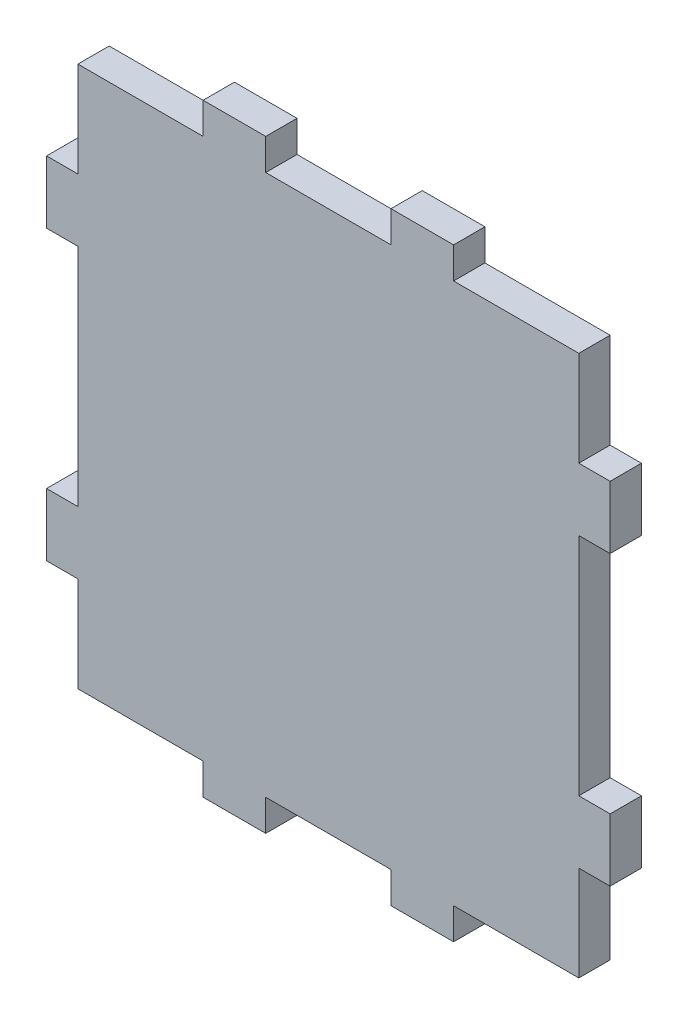
ISO-10303-21;
HEADER;
FILE_DESCRIPTION(('STEP AP214'),'2;1');
FILE_NAME('part.step','',(''),(''),'','','');
FILE_SCHEMA(('AUTOMOTIVE_DESIGN { 1 0 10303 214 1 1 1 1 }'));
ENDSEC;
DATA;
#1=APPLICATION_CONTEXT('core data for automotive mechanical design processes');
#2=APPLICATION_PROTOCOL_DEFINITION('international standard','automotive_design',2000,#1);
#3=PRODUCT_CONTEXT('',#1,'mechanical');
#4=PRODUCT('Part','Part','',(#3));
#5=PRODUCT_RELATED_PRODUCT_CATEGORY('part','',(#4));
#6=PRODUCT_DEFINITION_FORMATION('','',#4);
#7=PRODUCT_DEFINITION_CONTEXT('part definition',#1,'design');
#8=PRODUCT_DEFINITION('design','',#6,#7);
#9=PRODUCT_DEFINITION_SHAPE('','',#8);
#10=(LENGTH_UNIT() NAMED_UNIT(*) SI_UNIT(.MILLI.,.METRE.));
#11=(NAMED_UNIT(*) PLANE_ANGLE_UNIT() SI_UNIT($,.RADIAN.));
#12=(NAMED_UNIT(*) SI_UNIT($,.STERADIAN.) SOLID_ANGLE_UNIT());
#13=UNCERTAINTY_MEASURE_WITH_UNIT(LENGTH_MEASURE(1.E-05),#10,'distance_accuracy_value','');
#14=(GEOMETRIC_REPRESENTATION_CONTEXT(3) GLOBAL_UNCERTAINTY_ASSIGNED_CONTEXT((#13)) GLOBAL_UNIT_ASSIGNED_CONTEXT((#10,
#11,#12)) REPRESENTATION_CONTEXT('',''));
#15=CARTESIAN_POINT('',(0.,0.,0.));
#16=DIRECTION('',(0.,0.,1.));
#17=DIRECTION('',(1.,0.,0.));
#18=AXIS2_PLACEMENT_3D('',#15,#16,#17);
#19=CARTESIAN_POINT('',(-3.175,0.,3.175));
#20=DIRECTION('',(-1.,0.,0.));
#21=DIRECTION('',(0.,-1.,0.));
#22=AXIS2_PLACEMENT_3D('',#19,#20,#21);
#23=PLANE('',#22);
#24=DIRECTION('',(0.,1.,0.));
#25=VECTOR('',#24,1.);
#26=CARTESIAN_POINT('',(-3.175,0.,0.));
#27=LINE('',#26,#25);
#28=CARTESIAN_POINT('',(-3.175,-16.002,0.));
#29=VERTEX_POINT('',#28);
#30=CARTESIAN_POINT('',(-3.175,-9.652,0.));
#31=VERTEX_POINT('',#30);
#32=EDGE_CURVE('E297',#29,#31,#27,.T.);
#33=ORIENTED_EDGE('',*,*,#32,.F.);
#34=DIRECTION('',(0.,0.,-1.));
#35=VECTOR('',#34,1.);
#36=CARTESIAN_POINT('',(-3.175,-16.002,3.175));
#37=LINE('',#36,#35);
#38=CARTESIAN_POINT('',(-3.175,-16.002,3.175));
#39=VERTEX_POINT('',#38);
#40=EDGE_CURVE('E11',#39,#29,#37,.T.);
#41=ORIENTED_EDGE('',*,*,#40,.F.);
#42=DIRECTION('',(0.,1.,0.));
#43=VECTOR('',#42,1.);
#44=CARTESIAN_POINT('',(-3.175,0.,3.175));
#45=LINE('',#44,#43);
#46=CARTESIAN_POINT('',(-3.175,-9.652,3.175));
#47=VERTEX_POINT('',#46);
#48=EDGE_CURVE('E394',#39,#47,#45,.T.);
#49=ORIENTED_EDGE('',*,*,#48,.T.);
#50=DIRECTION('',(0.,0.,-1.));
#51=VECTOR('',#50,1.);
#52=CARTESIAN_POINT('',(-3.175,-9.652,3.175));
#53=LINE('',#52,#51);
#54=EDGE_CURVE('E169',#47,#31,#53,.T.);
#55=ORIENTED_EDGE('',*,*,#54,.T.);
#56=EDGE_LOOP('',(#33,#41,#49,#55));
#57=FACE_BOUND('',#56,.T.);
#58=ADVANCED_FACE('F35',(#57),#23,.T.);
#59=CARTESIAN_POINT('',(0.,-16.002,3.175));
#60=DIRECTION('',(0.,-1.,0.));
#61=DIRECTION('',(0.,0.,-1.));
#62=AXIS2_PLACEMENT_3D('',#59,#60,#61);
#63=PLANE('',#62);
#64=DIRECTION('',(-1.,0.,0.));
#65=VECTOR('',#64,1.);
#66=CARTESIAN_POINT('',(0.,-16.002,0.));
#67=LINE('',#66,#65);
#68=CARTESIAN_POINT('',(0.,-16.002,0.));
#69=VERTEX_POINT('',#68);
#70=EDGE_CURVE('E300',#69,#29,#67,.T.);
#71=ORIENTED_EDGE('',*,*,#70,.F.);
#72=DIRECTION('',(0.,0.,-1.));
#73=VECTOR('',#72,1.);
#74=CARTESIAN_POINT('',(0.,-16.002,3.175));
#75=LINE('',#74,#73);
#76=CARTESIAN_POINT('',(0.,-16.002,3.175));
#77=VERTEX_POINT('',#76);
#78=EDGE_CURVE('E43',#77,#69,#75,.T.);
#79=ORIENTED_EDGE('',*,*,#78,.F.);
#80=DIRECTION('',(-1.,0.,0.));
#81=VECTOR('',#80,1.);
#82=CARTESIAN_POINT('',(0.,-16.002,3.175));
#83=LINE('',#82,#81);
#84=EDGE_CURVE('E477',#77,#39,#83,.T.);
#85=ORIENTED_EDGE('',*,*,#84,.T.);
#86=ORIENTED_EDGE('',*,*,#40,.T.);
#87=EDGE_LOOP('',(#71,#79,#85,#86));
#88=FACE_BOUND('',#87,.T.);
#89=ADVANCED_FACE('F476',(#88),#63,.T.);
#90=CARTESIAN_POINT('',(0.,0.,3.175));
#91=DIRECTION('',(1.,0.,0.));
#92=DIRECTION('',(0.,1.,0.));
#93=AXIS2_PLACEMENT_3D('',#90,#91,#92);
#94=PLANE('',#93);
#95=DIRECTION('',(0.,-1.,0.));
#96=VECTOR('',#95,1.);
#97=CARTESIAN_POINT('',(0.,0.,0.));
#98=LINE('',#97,#96);
#99=CARTESIAN_POINT('',(0.,-38.862,0.));
#100=VERTEX_POINT('',#99);
#101=EDGE_CURVE('E303',#69,#100,#98,.T.);
#102=ORIENTED_EDGE('',*,*,#101,.T.);
#103=DIRECTION('',(0.,0.,-1.));
#104=VECTOR('',#103,1.);
#105=CARTESIAN_POINT('',(0.,-38.862,3.175));
#106=LINE('',#105,#104);
#107=CARTESIAN_POINT('',(0.,-38.862,3.175));
#108=VERTEX_POINT('',#107);
#109=EDGE_CURVE('E461',#108,#100,#106,.T.);
#110=ORIENTED_EDGE('',*,*,#109,.F.);
#111=DIRECTION('',(0.,-1.,0.));
#112=VECTOR('',#111,1.);
#113=CARTESIAN_POINT('',(0.,0.,3.175));
#114=LINE('',#113,#112);
#115=EDGE_CURVE('E468',#77,#108,#114,.T.);
#116=ORIENTED_EDGE('',*,*,#115,.F.);
#117=ORIENTED_EDGE('',*,*,#78,.T.);
#118=EDGE_LOOP('',(#102,#110,#116,#117));
#119=FACE_BOUND('',#118,.T.);
#120=ADVANCED_FACE('F466',(#119),#94,.F.);
#121=CARTESIAN_POINT('',(0.,-38.862,3.175));
#122=DIRECTION('',(0.,-1.,0.));
#123=DIRECTION('',(0.,0.,-1.));
#124=AXIS2_PLACEMENT_3D('',#121,#122,#123);
#125=PLANE('',#124);
#126=DIRECTION('',(-1.,0.,0.));
#127=VECTOR('',#126,1.);
#128=CARTESIAN_POINT('',(0.,-38.862,0.));
#129=LINE('',#128,#127);
#130=CARTESIAN_POINT('',(-3.17500000000001,-38.862,0.));
#131=VERTEX_POINT('',#130);
#132=EDGE_CURVE('E305',#100,#131,#129,.T.);
#133=ORIENTED_EDGE('',*,*,#132,.T.);
#134=DIRECTION('',(0.,0.,-1.));
#135=VECTOR('',#134,1.);
#136=CARTESIAN_POINT('',(-3.17500000000001,-38.862,3.175));
#137=LINE('',#136,#135);
#138=CARTESIAN_POINT('',(-3.17500000000001,-38.862,3.175));
#139=VERTEX_POINT('',#138);
#140=EDGE_CURVE('E459',#139,#131,#137,.T.);
#141=ORIENTED_EDGE('',*,*,#140,.F.);
#142=DIRECTION('',(-1.,0.,0.));
#143=VECTOR('',#142,1.);
#144=CARTESIAN_POINT('',(0.,-38.862,3.175));
#145=LINE('',#144,#143);
#146=EDGE_CURVE('E485',#108,#139,#145,.T.);
#147=ORIENTED_EDGE('',*,*,#146,.F.);
#148=ORIENTED_EDGE('',*,*,#109,.T.);
#149=EDGE_LOOP('',(#133,#141,#147,#148));
#150=FACE_BOUND('',#149,.T.);
#151=ADVANCED_FACE('F681',(#150),#125,.F.);
#152=CARTESIAN_POINT('',(-3.17500000000001,0.,3.175));
#153=DIRECTION('',(-1.,0.,0.));
#154=DIRECTION('',(0.,0.,1.));
#155=AXIS2_PLACEMENT_3D('',#152,#153,#154);
#156=PLANE('',#155);
#157=DIRECTION('',(0.,1.,0.));
#158=VECTOR('',#157,1.);
#159=CARTESIAN_POINT('',(-3.17500000000001,0.,0.));
#160=LINE('',#159,#158);
#161=CARTESIAN_POINT('',(-3.17500000000001,-45.212,0.));
#162=VERTEX_POINT('',#161);
#163=EDGE_CURVE('E308',#162,#131,#160,.T.);
#164=ORIENTED_EDGE('',*,*,#163,.F.);
#165=DIRECTION('',(0.,0.,-1.));
#166=VECTOR('',#165,1.);
#167=CARTESIAN_POINT('',(-3.17500000000001,-45.212,3.175));
#168=LINE('',#167,#166);
#169=CARTESIAN_POINT('',(-3.17500000000001,-45.212,3.175));
#170=VERTEX_POINT('',#169);
#171=EDGE_CURVE('E457',#170,#162,#168,.T.);
#172=ORIENTED_EDGE('',*,*,#171,.F.);
#173=DIRECTION('',(0.,1.,0.));
#174=VECTOR('',#173,1.);
#175=CARTESIAN_POINT('',(-3.17500000000001,0.,3.175));
#176=LINE('',#175,#174);
#177=EDGE_CURVE('E487',#170,#139,#176,.T.);
#178=ORIENTED_EDGE('',*,*,#177,.T.);
#179=ORIENTED_EDGE('',*,*,#140,.T.);
#180=EDGE_LOOP('',(#164,#172,#178,#179));
#181=FACE_BOUND('',#180,.T.);
#182=ADVANCED_FACE('F677',(#181),#156,.T.);
#183=CARTESIAN_POINT('',(0.,-45.212,3.175));
#184=DIRECTION('',(0.,-1.,0.));
#185=DIRECTION('',(0.,0.,-1.));
#186=AXIS2_PLACEMENT_3D('',#183,#184,#185);
#187=PLANE('',#186);
#188=DIRECTION('',(-1.,0.,0.));
#189=VECTOR('',#188,1.);
#190=CARTESIAN_POINT('',(0.,-45.212,0.));
#191=LINE('',#190,#189);
#192=CARTESIAN_POINT('',(0.,-45.212,0.));
#193=VERTEX_POINT('',#192);
#194=EDGE_CURVE('E311',#193,#162,#191,.T.);
#195=ORIENTED_EDGE('',*,*,#194,.F.);
#196=DIRECTION('',(0.,0.,-1.));
#197=VECTOR('',#196,1.);
#198=CARTESIAN_POINT('',(0.,-45.212,3.175));
#199=LINE('',#198,#197);
#200=CARTESIAN_POINT('',(0.,-45.212,3.175));
#201=VERTEX_POINT('',#200);
#202=EDGE_CURVE('E455',#201,#193,#199,.T.);
#203=ORIENTED_EDGE('',*,*,#202,.F.);
#204=DIRECTION('',(-1.,0.,0.));
#205=VECTOR('',#204,1.);
#206=CARTESIAN_POINT('',(0.,-45.212,3.175));
#207=LINE('',#206,#205);
#208=EDGE_CURVE('E490',#201,#170,#207,.T.);
#209=ORIENTED_EDGE('',*,*,#208,.T.);
#210=ORIENTED_EDGE('',*,*,#171,.T.);
#211=EDGE_LOOP('',(#195,#203,#209,#210));
#212=FACE_BOUND('',#211,.T.);
#213=ADVANCED_FACE('F671',(#212),#187,.T.);
#214=CARTESIAN_POINT('',(0.,0.,3.175));
#215=DIRECTION('',(1.,0.,0.));
#216=DIRECTION('',(0.,1.,0.));
#217=AXIS2_PLACEMENT_3D('',#214,#215,#216);
#218=PLANE('',#217);
#219=DIRECTION('',(0.,-1.,0.));
#220=VECTOR('',#219,1.);
#221=CARTESIAN_POINT('',(0.,0.,0.));
#222=LINE('',#221,#220);
#223=CARTESIAN_POINT('',(0.,-54.864,0.));
#224=VERTEX_POINT('',#223);
#225=EDGE_CURVE('E314',#193,#224,#222,.T.);
#226=ORIENTED_EDGE('',*,*,#225,.T.);
#227=DIRECTION('',(0.,0.,-1.));
#228=VECTOR('',#227,1.);
#229=CARTESIAN_POINT('',(0.,-54.864,3.175));
#230=LINE('',#229,#228);
#231=CARTESIAN_POINT('',(0.,-54.864,3.175));
#232=VERTEX_POINT('',#231);
#233=EDGE_CURVE('E452',#232,#224,#230,.T.);
#234=ORIENTED_EDGE('',*,*,#233,.F.);
#235=DIRECTION('',(0.,-1.,0.));
#236=VECTOR('',#235,1.);
#237=CARTESIAN_POINT('',(0.,0.,3.175));
#238=LINE('',#237,#236);
#239=EDGE_CURVE('E493',#201,#232,#238,.T.);
#240=ORIENTED_EDGE('',*,*,#239,.F.);
#241=ORIENTED_EDGE('',*,*,#202,.T.);
#242=EDGE_LOOP('',(#226,#234,#240,#241));
#243=FACE_BOUND('',#242,.T.);
#244=ADVANCED_FACE('F682',(#243),#218,.F.);
#245=CARTESIAN_POINT('',(0.,-54.864,3.175));
#246=DIRECTION('',(0.,1.,0.));
#247=DIRECTION('',(0.,0.,1.));
#248=AXIS2_PLACEMENT_3D('',#245,#246,#247);
#249=PLANE('',#248);
#250=DIRECTION('',(1.,0.,0.));
#251=VECTOR('',#250,1.);
#252=CARTESIAN_POINT('',(0.,-54.864,0.));
#253=LINE('',#252,#251);
#254=CARTESIAN_POINT('',(12.7,-54.864,0.));
#255=VERTEX_POINT('',#254);
#256=EDGE_CURVE('E316',#224,#255,#253,.T.);
#257=ORIENTED_EDGE('',*,*,#256,.T.);
#258=DIRECTION('',(0.,0.,-1.));
#259=VECTOR('',#258,1.);
#260=CARTESIAN_POINT('',(12.7,-54.864,3.175));
#261=LINE('',#260,#259);
#262=CARTESIAN_POINT('',(12.7,-54.864,3.175));
#263=VERTEX_POINT('',#262);
#264=EDGE_CURVE('E449',#263,#255,#261,.T.);
#265=ORIENTED_EDGE('',*,*,#264,.F.);
#266=DIRECTION('',(1.,0.,0.));
#267=VECTOR('',#266,1.);
#268=CARTESIAN_POINT('',(0.,-54.864,3.175));
#269=LINE('',#268,#267);
#270=EDGE_CURVE('E495',#232,#263,#269,.T.);
#271=ORIENTED_EDGE('',*,*,#270,.F.);
#272=ORIENTED_EDGE('',*,*,#233,.T.);
#273=EDGE_LOOP('',(#257,#265,#271,#272));
#274=FACE_BOUND('',#273,.T.);
#275=ADVANCED_FACE('F665',(#274),#249,.F.);
#276=CARTESIAN_POINT('',(12.7,0.,3.175));
#277=DIRECTION('',(1.,0.,0.));
#278=DIRECTION('',(0.,0.,-1.));
#279=AXIS2_PLACEMENT_3D('',#276,#277,#278);
#280=PLANE('',#279);
#281=DIRECTION('',(0.,-1.,0.));
#282=VECTOR('',#281,1.);
#283=CARTESIAN_POINT('',(12.7,0.,0.));
#284=LINE('',#283,#282);
#285=CARTESIAN_POINT('',(12.7,-58.039,0.));
#286=VERTEX_POINT('',#285);
#287=EDGE_CURVE('E318',#255,#286,#284,.T.);
#288=ORIENTED_EDGE('',*,*,#287,.T.);
#289=DIRECTION('',(0.,0.,-1.));
#290=VECTOR('',#289,1.);
#291=CARTESIAN_POINT('',(12.7,-58.039,3.175));
#292=LINE('',#291,#290);
#293=CARTESIAN_POINT('',(12.7,-58.039,3.175));
#294=VERTEX_POINT('',#293);
#295=EDGE_CURVE('E446',#294,#286,#292,.T.);
#296=ORIENTED_EDGE('',*,*,#295,.F.);
#297=DIRECTION('',(0.,-1.,0.));
#298=VECTOR('',#297,1.);
#299=CARTESIAN_POINT('',(12.7,0.,3.175));
#300=LINE('',#299,#298);
#301=EDGE_CURVE('E497',#263,#294,#300,.T.);
#302=ORIENTED_EDGE('',*,*,#301,.F.);
#303=ORIENTED_EDGE('',*,*,#264,.T.);
#304=EDGE_LOOP('',(#288,#296,#302,#303));
#305=FACE_BOUND('',#304,.T.);
#306=ADVANCED_FACE('F661',(#305),#280,.F.);
#307=CARTESIAN_POINT('',(0.,-58.039,3.175));
#308=DIRECTION('',(0.,1.,0.));
#309=DIRECTION('',(0.,0.,1.));
#310=AXIS2_PLACEMENT_3D('',#307,#308,#309);
#311=PLANE('',#310);
#312=DIRECTION('',(1.,0.,0.));
#313=VECTOR('',#312,1.);
#314=CARTESIAN_POINT('',(0.,-58.039,0.));
#315=LINE('',#314,#313);
#316=CARTESIAN_POINT('',(19.05,-58.039,0.));
#317=VERTEX_POINT('',#316);
#318=EDGE_CURVE('E320',#286,#317,#315,.T.);
#319=ORIENTED_EDGE('',*,*,#318,.T.);
#320=DIRECTION('',(0.,0.,-1.));
#321=VECTOR('',#320,1.);
#322=CARTESIAN_POINT('',(19.05,-58.039,3.175));
#323=LINE('',#322,#321);
#324=CARTESIAN_POINT('',(19.05,-58.039,3.175));
#325=VERTEX_POINT('',#324);
#326=EDGE_CURVE('E444',#325,#317,#323,.T.);
#327=ORIENTED_EDGE('',*,*,#326,.F.);
#328=DIRECTION('',(1.,0.,0.));
#329=VECTOR('',#328,1.);
#330=CARTESIAN_POINT('',(0.,-58.039,3.175));
#331=LINE('',#330,#329);
#332=EDGE_CURVE('E499',#294,#325,#331,.T.);
#333=ORIENTED_EDGE('',*,*,#332,.F.);
#334=ORIENTED_EDGE('',*,*,#295,.T.);
#335=EDGE_LOOP('',(#319,#327,#333,#334));
#336=FACE_BOUND('',#335,.T.);
#337=ADVANCED_FACE('F656',(#336),#311,.F.);
#338=CARTESIAN_POINT('',(19.0500000000001,0.,3.175));
#339=DIRECTION('',(1.,0.,0.));
#340=DIRECTION('',(0.,1.,0.));
#341=AXIS2_PLACEMENT_3D('',#338,#339,#340);
#342=PLANE('',#341);
#343=DIRECTION('',(0.,-1.,0.));
#344=VECTOR('',#343,1.);
#345=CARTESIAN_POINT('',(19.0500000000001,0.,0.));
#346=LINE('',#345,#344);
#347=CARTESIAN_POINT('',(19.05,-54.864,0.));
#348=VERTEX_POINT('',#347);
#349=EDGE_CURVE('E323',#348,#317,#346,.T.);
#350=ORIENTED_EDGE('',*,*,#349,.F.);
#351=DIRECTION('',(0.,0.,-1.));
#352=VECTOR('',#351,1.);
#353=CARTESIAN_POINT('',(19.05,-54.864,3.175));
#354=LINE('',#353,#352);
#355=CARTESIAN_POINT('',(19.05,-54.864,3.175));
#356=VERTEX_POINT('',#355);
#357=EDGE_CURVE('E442',#356,#348,#354,.T.);
#358=ORIENTED_EDGE('',*,*,#357,.F.);
#359=DIRECTION('',(0.,-1.,0.));
#360=VECTOR('',#359,1.);
#361=CARTESIAN_POINT('',(19.0500000000001,0.,3.175));
#362=LINE('',#361,#360);
#363=EDGE_CURVE('E501',#356,#325,#362,.T.);
#364=ORIENTED_EDGE('',*,*,#363,.T.);
#365=ORIENTED_EDGE('',*,*,#326,.T.);
#366=EDGE_LOOP('',(#350,#358,#364,#365));
#367=FACE_BOUND('',#366,.T.);
#368=ADVANCED_FACE('F650',(#367),#342,.T.);
#369=CARTESIAN_POINT('',(0.,-54.864,3.175));
#370=DIRECTION('',(0.,1.,0.));
#371=DIRECTION('',(-1.,0.,0.));
#372=AXIS2_PLACEMENT_3D('',#369,#370,#371);
#373=PLANE('',#372);
#374=DIRECTION('',(1.,0.,0.));
#375=VECTOR('',#374,1.);
#376=CARTESIAN_POINT('',(0.,-54.864,0.));
#377=LINE('',#376,#375);
#378=CARTESIAN_POINT('',(31.75,-54.864,0.));
#379=VERTEX_POINT('',#378);
#380=EDGE_CURVE('E326',#348,#379,#377,.T.);
#381=ORIENTED_EDGE('',*,*,#380,.T.);
#382=DIRECTION('',(0.,0.,-1.));
#383=VECTOR('',#382,1.);
#384=CARTESIAN_POINT('',(31.75,-54.864,3.175));
#385=LINE('',#384,#383);
#386=CARTESIAN_POINT('',(31.75,-54.864,3.175));
#387=VERTEX_POINT('',#386);
#388=EDGE_CURVE('E439',#387,#379,#385,.T.);
#389=ORIENTED_EDGE('',*,*,#388,.F.);
#390=DIRECTION('',(1.,0.,0.));
#391=VECTOR('',#390,1.);
#392=CARTESIAN_POINT('',(0.,-54.864,3.175));
#393=LINE('',#392,#391);
#394=EDGE_CURVE('E504',#356,#387,#393,.T.);
#395=ORIENTED_EDGE('',*,*,#394,.F.);
#396=ORIENTED_EDGE('',*,*,#357,.T.);
#397=EDGE_LOOP('',(#381,#389,#395,#396));
#398=FACE_BOUND('',#397,.T.);
#399=ADVANCED_FACE('F647',(#398),#373,.F.);
#400=CARTESIAN_POINT('',(31.75,0.,3.175));
#401=DIRECTION('',(1.,0.,0.));
#402=DIRECTION('',(0.,0.,-1.));
#403=AXIS2_PLACEMENT_3D('',#400,#401,#402);
#404=PLANE('',#403);
#405=DIRECTION('',(0.,-1.,0.));
#406=VECTOR('',#405,1.);
#407=CARTESIAN_POINT('',(31.75,0.,0.));
#408=LINE('',#407,#406);
#409=CARTESIAN_POINT('',(31.75,-58.039,0.));
#410=VERTEX_POINT('',#409);
#411=EDGE_CURVE('E328',#379,#410,#408,.T.);
#412=ORIENTED_EDGE('',*,*,#411,.T.);
#413=DIRECTION('',(0.,0.,-1.));
#414=VECTOR('',#413,1.);
#415=CARTESIAN_POINT('',(31.75,-58.039,3.175));
#416=LINE('',#415,#414);
#417=CARTESIAN_POINT('',(31.75,-58.039,3.175));
#418=VERTEX_POINT('',#417);
#419=EDGE_CURVE('E436',#418,#410,#416,.T.);
#420=ORIENTED_EDGE('',*,*,#419,.F.);
#421=DIRECTION('',(0.,-1.,0.));
#422=VECTOR('',#421,1.);
#423=CARTESIAN_POINT('',(31.75,0.,3.175));
#424=LINE('',#423,#422);
#425=EDGE_CURVE('E506',#387,#418,#424,.T.);
#426=ORIENTED_EDGE('',*,*,#425,.F.);
#427=ORIENTED_EDGE('',*,*,#388,.T.);
#428=EDGE_LOOP('',(#412,#420,#426,#427));
#429=FACE_BOUND('',#428,.T.);
#430=ADVANCED_FACE('F642',(#429),#404,.F.);
#431=CARTESIAN_POINT('',(0.,-58.039,3.175));
#432=DIRECTION('',(0.,1.,0.));
#433=DIRECTION('',(0.,0.,1.));
#434=AXIS2_PLACEMENT_3D('',#431,#432,#433);
#435=PLANE('',#434);
#436=DIRECTION('',(1.,0.,0.));
#437=VECTOR('',#436,1.);
#438=CARTESIAN_POINT('',(0.,-58.039,0.));
#439=LINE('',#438,#437);
#440=CARTESIAN_POINT('',(38.1,-58.039,0.));
#441=VERTEX_POINT('',#440);
#442=EDGE_CURVE('E330',#410,#441,#439,.T.);
#443=ORIENTED_EDGE('',*,*,#442,.T.);
#444=DIRECTION('',(0.,0.,-1.));
#445=VECTOR('',#444,1.);
#446=CARTESIAN_POINT('',(38.1,-58.039,3.175));
#447=LINE('',#446,#445);
#448=CARTESIAN_POINT('',(38.1,-58.039,3.175));
#449=VERTEX_POINT('',#448);
#450=EDGE_CURVE('E434',#449,#441,#447,.T.);
#451=ORIENTED_EDGE('',*,*,#450,.F.);
#452=DIRECTION('',(1.,0.,0.));
#453=VECTOR('',#452,1.);
#454=CARTESIAN_POINT('',(0.,-58.039,3.175));
#455=LINE('',#454,#453);
#456=EDGE_CURVE('E508',#418,#449,#455,.T.);
#457=ORIENTED_EDGE('',*,*,#456,.F.);
#458=ORIENTED_EDGE('',*,*,#419,.T.);
#459=EDGE_LOOP('',(#443,#451,#457,#458));
#460=FACE_BOUND('',#459,.T.);
#461=ADVANCED_FACE('F636',(#460),#435,.F.);
#462=CARTESIAN_POINT('',(38.1,0.,3.175));
#463=DIRECTION('',(1.,0.,0.));
#464=DIRECTION('',(0.,0.,-1.));
#465=AXIS2_PLACEMENT_3D('',#462,#463,#464);
#466=PLANE('',#465);
#467=DIRECTION('',(0.,-1.,0.));
#468=VECTOR('',#467,1.);
#469=CARTESIAN_POINT('',(38.1,0.,0.));
#470=LINE('',#469,#468);
#471=CARTESIAN_POINT('',(38.1,-54.864,0.));
#472=VERTEX_POINT('',#471);
#473=EDGE_CURVE('E333',#472,#441,#470,.T.);
#474=ORIENTED_EDGE('',*,*,#473,.F.);
#475=DIRECTION('',(0.,0.,-1.));
#476=VECTOR('',#475,1.);
#477=CARTESIAN_POINT('',(38.1,-54.864,3.175));
#478=LINE('',#477,#476);
#479=CARTESIAN_POINT('',(38.1,-54.864,3.175));
#480=VERTEX_POINT('',#479);
#481=EDGE_CURVE('E432',#480,#472,#478,.T.);
#482=ORIENTED_EDGE('',*,*,#481,.F.);
#483=DIRECTION('',(0.,-1.,0.));
#484=VECTOR('',#483,1.);
#485=CARTESIAN_POINT('',(38.1,0.,3.175));
#486=LINE('',#485,#484);
#487=EDGE_CURVE('E510',#480,#449,#486,.T.);
#488=ORIENTED_EDGE('',*,*,#487,.T.);
#489=ORIENTED_EDGE('',*,*,#450,.T.);
#490=EDGE_LOOP('',(#474,#482,#488,#489));
#491=FACE_BOUND('',#490,.T.);
#492=ADVANCED_FACE('F630',(#491),#466,.T.);
#493=CARTESIAN_POINT('',(0.,-54.864,3.175));
#494=DIRECTION('',(0.,1.,0.));
#495=DIRECTION('',(0.,0.,1.));
#496=AXIS2_PLACEMENT_3D('',#493,#494,#495);
#497=PLANE('',#496);
#498=DIRECTION('',(1.,0.,0.));
#499=VECTOR('',#498,1.);
#500=CARTESIAN_POINT('',(0.,-54.864,0.));
#501=LINE('',#500,#499);
#502=CARTESIAN_POINT('',(50.8,-54.864,0.));
#503=VERTEX_POINT('',#502);
#504=EDGE_CURVE('E336',#472,#503,#501,.T.);
#505=ORIENTED_EDGE('',*,*,#504,.T.);
#506=DIRECTION('',(0.,0.,-1.));
#507=VECTOR('',#506,1.);
#508=CARTESIAN_POINT('',(50.8,-54.864,3.175));
#509=LINE('',#508,#507);
#510=CARTESIAN_POINT('',(50.8,-54.864,3.175));
#511=VERTEX_POINT('',#510);
#512=EDGE_CURVE('E430',#511,#503,#509,.T.);
#513=ORIENTED_EDGE('',*,*,#512,.F.);
#514=DIRECTION('',(1.,0.,0.));
#515=VECTOR('',#514,1.);
#516=CARTESIAN_POINT('',(0.,-54.864,3.175));
#517=LINE('',#516,#515);
#518=EDGE_CURVE('E513',#480,#511,#517,.T.);
#519=ORIENTED_EDGE('',*,*,#518,.F.);
#520=ORIENTED_EDGE('',*,*,#481,.T.);
#521=EDGE_LOOP('',(#505,#513,#519,#520));
#522=FACE_BOUND('',#521,.T.);
#523=ADVANCED_FACE('F778',(#522),#497,.F.);
#524=CARTESIAN_POINT('',(50.8,0.,3.175));
#525=DIRECTION('',(1.,0.,0.));
#526=DIRECTION('',(0.,0.,-1.));
#527=AXIS2_PLACEMENT_3D('',#524,#525,#526);
#528=PLANE('',#527);
#529=DIRECTION('',(0.,-1.,0.));
#530=VECTOR('',#529,1.);
#531=CARTESIAN_POINT('',(50.8,0.,0.));
#532=LINE('',#531,#530);
#533=CARTESIAN_POINT('',(50.8,-45.212,0.));
#534=VERTEX_POINT('',#533);
#535=EDGE_CURVE('E339',#534,#503,#532,.T.);
#536=ORIENTED_EDGE('',*,*,#535,.F.);
#537=DIRECTION('',(0.,0.,-1.));
#538=VECTOR('',#537,1.);
#539=CARTESIAN_POINT('',(50.8,-45.212,3.175));
#540=LINE('',#539,#538);
#541=CARTESIAN_POINT('',(50.8,-45.212,3.175));
#542=VERTEX_POINT('',#541);
#543=EDGE_CURVE('E428',#542,#534,#540,.T.);
#544=ORIENTED_EDGE('',*,*,#543,.F.);
#545=DIRECTION('',(0.,-1.,0.));
#546=VECTOR('',#545,1.);
#547=CARTESIAN_POINT('',(50.8,0.,3.175));
#548=LINE('',#547,#546);
#549=EDGE_CURVE('E515',#542,#511,#548,.T.);
#550=ORIENTED_EDGE('',*,*,#549,.T.);
#551=ORIENTED_EDGE('',*,*,#512,.T.);
#552=EDGE_LOOP('',(#536,#544,#550,#551));
#553=FACE_BOUND('',#552,.T.);
#554=ADVANCED_FACE('F623',(#553),#528,.T.);
#555=CARTESIAN_POINT('',(0.,-45.212,3.175));
#556=DIRECTION('',(0.,1.,0.));
#557=DIRECTION('',(0.,0.,1.));
#558=AXIS2_PLACEMENT_3D('',#555,#556,#557);
#559=PLANE('',#558);
#560=DIRECTION('',(1.,0.,0.));
#561=VECTOR('',#560,1.);
#562=CARTESIAN_POINT('',(0.,-45.212,0.));
#563=LINE('',#562,#561);
#564=CARTESIAN_POINT('',(53.975,-45.212,0.));
#565=VERTEX_POINT('',#564);
#566=EDGE_CURVE('E342',#534,#565,#563,.T.);
#567=ORIENTED_EDGE('',*,*,#566,.T.);
#568=DIRECTION('',(0.,0.,-1.));
#569=VECTOR('',#568,1.);
#570=CARTESIAN_POINT('',(53.975,-45.212,3.175));
#571=LINE('',#570,#569);
#572=CARTESIAN_POINT('',(53.975,-45.212,3.175));
#573=VERTEX_POINT('',#572);
#574=EDGE_CURVE('E426',#573,#565,#571,.T.);
#575=ORIENTED_EDGE('',*,*,#574,.F.);
#576=DIRECTION('',(1.,0.,0.));
#577=VECTOR('',#576,1.);
#578=CARTESIAN_POINT('',(0.,-45.212,3.175));
#579=LINE('',#578,#577);
#580=EDGE_CURVE('E518',#542,#573,#579,.T.);
#581=ORIENTED_EDGE('',*,*,#580,.F.);
#582=ORIENTED_EDGE('',*,*,#543,.T.);
#583=EDGE_LOOP('',(#567,#575,#581,#582));
#584=FACE_BOUND('',#583,.T.);
#585=ADVANCED_FACE('F620',(#584),#559,.F.);
#586=CARTESIAN_POINT('',(53.975,0.,3.175));
#587=DIRECTION('',(1.,0.,0.));
#588=DIRECTION('',(0.,0.,-1.));
#589=AXIS2_PLACEMENT_3D('',#586,#587,#588);
#590=PLANE('',#589);
#591=DIRECTION('',(0.,-1.,0.));
#592=VECTOR('',#591,1.);
#593=CARTESIAN_POINT('',(53.975,0.,0.));
#594=LINE('',#593,#592);
#595=CARTESIAN_POINT('',(53.975,-38.862,0.));
#596=VERTEX_POINT('',#595);
#597=EDGE_CURVE('E345',#596,#565,#594,.T.);
#598=ORIENTED_EDGE('',*,*,#597,.F.);
#599=DIRECTION('',(0.,0.,-1.));
#600=VECTOR('',#599,1.);
#601=CARTESIAN_POINT('',(53.975,-38.862,3.175));
#602=LINE('',#601,#600);
#603=CARTESIAN_POINT('',(53.975,-38.862,3.175));
#604=VERTEX_POINT('',#603);
#605=EDGE_CURVE('E424',#604,#596,#602,.T.);
#606=ORIENTED_EDGE('',*,*,#605,.F.);
#607=DIRECTION('',(0.,-1.,0.));
#608=VECTOR('',#607,1.);
#609=CARTESIAN_POINT('',(53.975,0.,3.175));
#610=LINE('',#609,#608);
#611=EDGE_CURVE('E520',#604,#573,#610,.T.);
#612=ORIENTED_EDGE('',*,*,#611,.T.);
#613=ORIENTED_EDGE('',*,*,#574,.T.);
#614=EDGE_LOOP('',(#598,#606,#612,#613));
#615=FACE_BOUND('',#614,.T.);
#616=ADVANCED_FACE('F615',(#615),#590,.T.);
#617=CARTESIAN_POINT('',(1.6986412276765E-13,-38.8620000000002,3.175));
#618=DIRECTION('',(0.,1.,0.));
#619=DIRECTION('',(-1.,0.,0.));
#620=AXIS2_PLACEMENT_3D('',#617,#618,#619);
#621=PLANE('',#620);
#622=DIRECTION('',(1.,0.,0.));
#623=VECTOR('',#622,1.);
#624=CARTESIAN_POINT('',(1.6986412276765E-13,-38.8620000000002,0.));
#625=LINE('',#624,#623);
#626=CARTESIAN_POINT('',(50.8,-38.862,0.));
#627=VERTEX_POINT('',#626);
#628=EDGE_CURVE('E348',#627,#596,#625,.T.);
#629=ORIENTED_EDGE('',*,*,#628,.F.);
#630=DIRECTION('',(0.,0.,-1.));
#631=VECTOR('',#630,1.);
#632=CARTESIAN_POINT('',(50.8,-38.862,3.175));
#633=LINE('',#632,#631);
#634=CARTESIAN_POINT('',(50.8,-38.862,3.175));
#635=VERTEX_POINT('',#634);
#636=EDGE_CURVE('E422',#635,#627,#633,.T.);
#637=ORIENTED_EDGE('',*,*,#636,.F.);
#638=DIRECTION('',(1.,0.,0.));
#639=VECTOR('',#638,1.);
#640=CARTESIAN_POINT('',(1.6986412276765E-13,-38.8620000000002,3.175));
#641=LINE('',#640,#639);
#642=EDGE_CURVE('E523',#635,#604,#641,.T.);
#643=ORIENTED_EDGE('',*,*,#642,.T.);
#644=ORIENTED_EDGE('',*,*,#605,.T.);
#645=EDGE_LOOP('',(#629,#637,#643,#644));
#646=FACE_BOUND('',#645,.T.);
#647=ADVANCED_FACE('F610',(#646),#621,.T.);
#648=CARTESIAN_POINT('',(50.8,0.,3.175));
#649=DIRECTION('',(1.,0.,0.));
#650=DIRECTION('',(0.,0.,-1.));
#651=AXIS2_PLACEMENT_3D('',#648,#649,#650);
#652=PLANE('',#651);
#653=DIRECTION('',(0.,-1.,0.));
#654=VECTOR('',#653,1.);
#655=CARTESIAN_POINT('',(50.8,0.,0.));
#656=LINE('',#655,#654);
#657=CARTESIAN_POINT('',(50.8,-16.002,0.));
#658=VERTEX_POINT('',#657);
#659=EDGE_CURVE('E351',#658,#627,#656,.T.);
#660=ORIENTED_EDGE('',*,*,#659,.F.);
#661=DIRECTION('',(0.,0.,-1.));
#662=VECTOR('',#661,1.);
#663=CARTESIAN_POINT('',(50.8,-16.002,3.175));
#664=LINE('',#663,#662);
#665=CARTESIAN_POINT('',(50.8,-16.002,3.175));
#666=VERTEX_POINT('',#665);
#667=EDGE_CURVE('E420',#666,#658,#664,.T.);
#668=ORIENTED_EDGE('',*,*,#667,.F.);
#669=DIRECTION('',(0.,-1.,0.));
#670=VECTOR('',#669,1.);
#671=CARTESIAN_POINT('',(50.8,0.,3.175));
#672=LINE('',#671,#670);
#673=EDGE_CURVE('E526',#666,#635,#672,.T.);
#674=ORIENTED_EDGE('',*,*,#673,.T.);
#675=ORIENTED_EDGE('',*,*,#636,.T.);
#676=EDGE_LOOP('',(#660,#668,#674,#675));
#677=FACE_BOUND('',#676,.T.);
#678=ADVANCED_FACE('F604',(#677),#652,.T.);
#679=CARTESIAN_POINT('',(0.,-16.002,3.175));
#680=DIRECTION('',(0.,1.,0.));
#681=DIRECTION('',(0.,0.,1.));
#682=AXIS2_PLACEMENT_3D('',#679,#680,#681);
#683=PLANE('',#682);
#684=DIRECTION('',(1.,0.,0.));
#685=VECTOR('',#684,1.);
#686=CARTESIAN_POINT('',(0.,-16.002,0.));
#687=LINE('',#686,#685);
#688=CARTESIAN_POINT('',(53.975,-16.002,0.));
#689=VERTEX_POINT('',#688);
#690=EDGE_CURVE('E354',#658,#689,#687,.T.);
#691=ORIENTED_EDGE('',*,*,#690,.T.);
#692=DIRECTION('',(0.,0.,-1.));
#693=VECTOR('',#692,1.);
#694=CARTESIAN_POINT('',(53.975,-16.002,3.175));
#695=LINE('',#694,#693);
#696=CARTESIAN_POINT('',(53.975,-16.002,3.175));
#697=VERTEX_POINT('',#696);
#698=EDGE_CURVE('E418',#697,#689,#695,.T.);
#699=ORIENTED_EDGE('',*,*,#698,.F.);
#700=DIRECTION('',(1.,0.,0.));
#701=VECTOR('',#700,1.);
#702=CARTESIAN_POINT('',(0.,-16.002,3.175));
#703=LINE('',#702,#701);
#704=EDGE_CURVE('E529',#666,#697,#703,.T.);
#705=ORIENTED_EDGE('',*,*,#704,.F.);
#706=ORIENTED_EDGE('',*,*,#667,.T.);
#707=EDGE_LOOP('',(#691,#699,#705,#706));
#708=FACE_BOUND('',#707,.T.);
#709=ADVANCED_FACE('F827',(#708),#683,.F.);
#710=CARTESIAN_POINT('',(53.975,0.,3.175));
#711=DIRECTION('',(1.,0.,0.));
#712=DIRECTION('',(0.,0.,-1.));
#713=AXIS2_PLACEMENT_3D('',#710,#711,#712);
#714=PLANE('',#713);
#715=DIRECTION('',(0.,-1.,0.));
#716=VECTOR('',#715,1.);
#717=CARTESIAN_POINT('',(53.975,0.,0.));
#718=LINE('',#717,#716);
#719=CARTESIAN_POINT('',(53.975,-9.65200000000002,0.));
#720=VERTEX_POINT('',#719);
#721=EDGE_CURVE('E357',#720,#689,#718,.T.);
#722=ORIENTED_EDGE('',*,*,#721,.F.);
#723=DIRECTION('',(0.,0.,-1.));
#724=VECTOR('',#723,1.);
#725=CARTESIAN_POINT('',(53.975,-9.65200000000002,3.175));
#726=LINE('',#725,#724);
#727=CARTESIAN_POINT('',(53.975,-9.65200000000002,3.175));
#728=VERTEX_POINT('',#727);
#729=EDGE_CURVE('E416',#728,#720,#726,.T.);
#730=ORIENTED_EDGE('',*,*,#729,.F.);
#731=DIRECTION('',(0.,-1.,0.));
#732=VECTOR('',#731,1.);
#733=CARTESIAN_POINT('',(53.975,0.,3.175));
#734=LINE('',#733,#732);
#735=EDGE_CURVE('E531',#728,#697,#734,.T.);
#736=ORIENTED_EDGE('',*,*,#735,.T.);
#737=ORIENTED_EDGE('',*,*,#698,.T.);
#738=EDGE_LOOP('',(#722,#730,#736,#737));
#739=FACE_BOUND('',#738,.T.);
#740=ADVANCED_FACE('F598',(#739),#714,.T.);
#741=CARTESIAN_POINT('',(0.,-9.65200000000002,3.175));
#742=DIRECTION('',(0.,1.,0.));
#743=DIRECTION('',(0.,0.,1.));
#744=AXIS2_PLACEMENT_3D('',#741,#742,#743);
#745=PLANE('',#744);
#746=DIRECTION('',(1.,0.,0.));
#747=VECTOR('',#746,1.);
#748=CARTESIAN_POINT('',(0.,-9.65200000000002,0.));
#749=LINE('',#748,#747);
#750=CARTESIAN_POINT('',(50.8,-9.65200000000002,0.));
#751=VERTEX_POINT('',#750);
#752=EDGE_CURVE('E360',#751,#720,#749,.T.);
#753=ORIENTED_EDGE('',*,*,#752,.F.);
#754=DIRECTION('',(0.,0.,-1.));
#755=VECTOR('',#754,1.);
#756=CARTESIAN_POINT('',(50.8,-9.65200000000002,3.175));
#757=LINE('',#756,#755);
#758=CARTESIAN_POINT('',(50.8,-9.65200000000002,3.175));
#759=VERTEX_POINT('',#758);
#760=EDGE_CURVE('E414',#759,#751,#757,.T.);
#761=ORIENTED_EDGE('',*,*,#760,.F.);
#762=DIRECTION('',(1.,0.,0.));
#763=VECTOR('',#762,1.);
#764=CARTESIAN_POINT('',(0.,-9.65200000000002,3.175));
#765=LINE('',#764,#763);
#766=EDGE_CURVE('E534',#759,#728,#765,.T.);
#767=ORIENTED_EDGE('',*,*,#766,.T.);
#768=ORIENTED_EDGE('',*,*,#729,.T.);
#769=EDGE_LOOP('',(#753,#761,#767,#768));
#770=FACE_BOUND('',#769,.T.);
#771=ADVANCED_FACE('F594',(#770),#745,.T.);
#772=CARTESIAN_POINT('',(50.8,0.,3.175));
#773=DIRECTION('',(1.,0.,0.));
#774=DIRECTION('',(0.,0.,-1.));
#775=AXIS2_PLACEMENT_3D('',#772,#773,#774);
#776=PLANE('',#775);
#777=DIRECTION('',(0.,-1.,0.));
#778=VECTOR('',#777,1.);
#779=CARTESIAN_POINT('',(50.8,0.,0.));
#780=LINE('',#779,#778);
#781=CARTESIAN_POINT('',(50.8,0.,0.));
#782=VERTEX_POINT('',#781);
#783=EDGE_CURVE('E363',#782,#751,#780,.T.);
#784=ORIENTED_EDGE('',*,*,#783,.F.);
#785=DIRECTION('',(0.,0.,-1.));
#786=VECTOR('',#785,1.);
#787=CARTESIAN_POINT('',(50.8,0.,3.175));
#788=LINE('',#787,#786);
#789=CARTESIAN_POINT('',(50.8,0.,3.175));
#790=VERTEX_POINT('',#789);
#791=EDGE_CURVE('E412',#790,#782,#788,.T.);
#792=ORIENTED_EDGE('',*,*,#791,.F.);
#793=DIRECTION('',(0.,-1.,0.));
#794=VECTOR('',#793,1.);
#795=CARTESIAN_POINT('',(50.8,0.,3.175));
#796=LINE('',#795,#794);
#797=EDGE_CURVE('E537',#790,#759,#796,.T.);
#798=ORIENTED_EDGE('',*,*,#797,.T.);
#799=ORIENTED_EDGE('',*,*,#760,.T.);
#800=EDGE_LOOP('',(#784,#792,#798,#799));
#801=FACE_BOUND('',#800,.T.);
#802=ADVANCED_FACE('F590',(#801),#776,.T.);
#803=CARTESIAN_POINT('',(0.,0.,3.175));
#804=DIRECTION('',(0.,1.,0.));
#805=DIRECTION('',(0.,0.,1.));
#806=AXIS2_PLACEMENT_3D('',#803,#804,#805);
#807=PLANE('',#806);
#808=DIRECTION('',(1.,0.,0.));
#809=VECTOR('',#808,1.);
#810=CARTESIAN_POINT('',(0.,0.,0.));
#811=LINE('',#810,#809);
#812=CARTESIAN_POINT('',(38.1,0.,0.));
#813=VERTEX_POINT('',#812);
#814=EDGE_CURVE('E366',#813,#782,#811,.T.);
#815=ORIENTED_EDGE('',*,*,#814,.F.);
#816=DIRECTION('',(0.,0.,-1.));
#817=VECTOR('',#816,1.);
#818=CARTESIAN_POINT('',(38.1,0.,3.175));
#819=LINE('',#818,#817);
#820=CARTESIAN_POINT('',(38.1,0.,3.175));
#821=VERTEX_POINT('',#820);
#822=EDGE_CURVE('E410',#821,#813,#819,.T.);
#823=ORIENTED_EDGE('',*,*,#822,.F.);
#824=DIRECTION('',(1.,0.,0.));
#825=VECTOR('',#824,1.);
#826=CARTESIAN_POINT('',(0.,0.,3.175));
#827=LINE('',#826,#825);
#828=EDGE_CURVE('E540',#821,#790,#827,.T.);
#829=ORIENTED_EDGE('',*,*,#828,.T.);
#830=ORIENTED_EDGE('',*,*,#791,.T.);
#831=EDGE_LOOP('',(#815,#823,#829,#830));
#832=FACE_BOUND('',#831,.T.);
#833=ADVANCED_FACE('F586',(#832),#807,.T.);
#834=CARTESIAN_POINT('',(38.1,0.,3.175));
#835=DIRECTION('',(-1.,0.,0.));
#836=DIRECTION('',(0.,0.,1.));
#837=AXIS2_PLACEMENT_3D('',#834,#835,#836);
#838=PLANE('',#837);
#839=DIRECTION('',(0.,1.,0.));
#840=VECTOR('',#839,1.);
#841=CARTESIAN_POINT('',(38.1,0.,0.));
#842=LINE('',#841,#840);
#843=CARTESIAN_POINT('',(38.1,3.17499999999998,0.));
#844=VERTEX_POINT('',#843);
#845=EDGE_CURVE('E369',#813,#844,#842,.T.);
#846=ORIENTED_EDGE('',*,*,#845,.T.);
#847=DIRECTION('',(0.,0.,-1.));
#848=VECTOR('',#847,1.);
#849=CARTESIAN_POINT('',(38.1,3.17499999999998,3.175));
#850=LINE('',#849,#848);
#851=CARTESIAN_POINT('',(38.1,3.17499999999998,3.175));
#852=VERTEX_POINT('',#851);
#853=EDGE_CURVE('E408',#852,#844,#850,.T.);
#854=ORIENTED_EDGE('',*,*,#853,.F.);
#855=DIRECTION('',(0.,1.,0.));
#856=VECTOR('',#855,1.);
#857=CARTESIAN_POINT('',(38.1,0.,3.175));
#858=LINE('',#857,#856);
#859=EDGE_CURVE('E543',#821,#852,#858,.T.);
#860=ORIENTED_EDGE('',*,*,#859,.F.);
#861=ORIENTED_EDGE('',*,*,#822,.T.);
#862=EDGE_LOOP('',(#846,#854,#860,#861));
#863=FACE_BOUND('',#862,.T.);
#864=ADVANCED_FACE('F583',(#863),#838,.F.);
#865=CARTESIAN_POINT('',(0.,3.17499999999998,3.175));
#866=DIRECTION('',(0.,1.,0.));
#867=DIRECTION('',(0.,0.,1.));
#868=AXIS2_PLACEMENT_3D('',#865,#866,#867);
#869=PLANE('',#868);
#870=DIRECTION('',(1.,0.,0.));
#871=VECTOR('',#870,1.);
#872=CARTESIAN_POINT('',(0.,3.17499999999998,0.));
#873=LINE('',#872,#871);
#874=CARTESIAN_POINT('',(31.75,3.17499999999998,0.));
#875=VERTEX_POINT('',#874);
#876=EDGE_CURVE('E372',#875,#844,#873,.T.);
#877=ORIENTED_EDGE('',*,*,#876,.F.);
#878=DIRECTION('',(0.,0.,-1.));
#879=VECTOR('',#878,1.);
#880=CARTESIAN_POINT('',(31.75,3.17499999999998,3.175));
#881=LINE('',#880,#879);
#882=CARTESIAN_POINT('',(31.75,3.17499999999998,3.175));
#883=VERTEX_POINT('',#882);
#884=EDGE_CURVE('E406',#883,#875,#881,.T.);
#885=ORIENTED_EDGE('',*,*,#884,.F.);
#886=DIRECTION('',(1.,0.,0.));
#887=VECTOR('',#886,1.);
#888=CARTESIAN_POINT('',(0.,3.17499999999998,3.175));
#889=LINE('',#888,#887);
#890=EDGE_CURVE('E545',#883,#852,#889,.T.);
#891=ORIENTED_EDGE('',*,*,#890,.T.);
#892=ORIENTED_EDGE('',*,*,#853,.T.);
#893=EDGE_LOOP('',(#877,#885,#891,#892));
#894=FACE_BOUND('',#893,.T.);
#895=ADVANCED_FACE('F578',(#894),#869,.T.);
#896=CARTESIAN_POINT('',(31.75,0.,3.175));
#897=DIRECTION('',(-1.,0.,0.));
#898=DIRECTION('',(0.,0.,1.));
#899=AXIS2_PLACEMENT_3D('',#896,#897,#898);
#900=PLANE('',#899);
#901=DIRECTION('',(0.,1.,0.));
#902=VECTOR('',#901,1.);
#903=CARTESIAN_POINT('',(31.75,0.,0.));
#904=LINE('',#903,#902);
#905=CARTESIAN_POINT('',(31.75,0.,0.));
#906=VERTEX_POINT('',#905);
#907=EDGE_CURVE('E375',#906,#875,#904,.T.);
#908=ORIENTED_EDGE('',*,*,#907,.F.);
#909=DIRECTION('',(0.,0.,-1.));
#910=VECTOR('',#909,1.);
#911=CARTESIAN_POINT('',(31.75,0.,3.175));
#912=LINE('',#911,#910);
#913=CARTESIAN_POINT('',(31.75,0.,3.175));
#914=VERTEX_POINT('',#913);
#915=EDGE_CURVE('E404',#914,#906,#912,.T.);
#916=ORIENTED_EDGE('',*,*,#915,.F.);
#917=DIRECTION('',(0.,1.,0.));
#918=VECTOR('',#917,1.);
#919=CARTESIAN_POINT('',(31.75,0.,3.175));
#920=LINE('',#919,#918);
#921=EDGE_CURVE('E548',#914,#883,#920,.T.);
#922=ORIENTED_EDGE('',*,*,#921,.T.);
#923=ORIENTED_EDGE('',*,*,#884,.T.);
#924=EDGE_LOOP('',(#908,#916,#922,#923));
#925=FACE_BOUND('',#924,.T.);
#926=ADVANCED_FACE('F573',(#925),#900,.T.);
#927=CARTESIAN_POINT('',(0.,0.,3.175));
#928=DIRECTION('',(0.,1.,0.));
#929=DIRECTION('',(-1.,0.,0.));
#930=AXIS2_PLACEMENT_3D('',#927,#928,#929);
#931=PLANE('',#930);
#932=DIRECTION('',(1.,0.,0.));
#933=VECTOR('',#932,1.);
#934=CARTESIAN_POINT('',(0.,0.,0.));
#935=LINE('',#934,#933);
#936=CARTESIAN_POINT('',(19.05,0.,0.));
#937=VERTEX_POINT('',#936);
#938=EDGE_CURVE('E378',#937,#906,#935,.T.);
#939=ORIENTED_EDGE('',*,*,#938,.F.);
#940=DIRECTION('',(0.,0.,-1.));
#941=VECTOR('',#940,1.);
#942=CARTESIAN_POINT('',(19.05,0.,3.175));
#943=LINE('',#942,#941);
#944=CARTESIAN_POINT('',(19.05,0.,3.175));
#945=VERTEX_POINT('',#944);
#946=EDGE_CURVE('E402',#945,#937,#943,.T.);
#947=ORIENTED_EDGE('',*,*,#946,.F.);
#948=DIRECTION('',(1.,0.,0.));
#949=VECTOR('',#948,1.);
#950=CARTESIAN_POINT('',(0.,0.,3.175));
#951=LINE('',#950,#949);
#952=EDGE_CURVE('E551',#945,#914,#951,.T.);
#953=ORIENTED_EDGE('',*,*,#952,.T.);
#954=ORIENTED_EDGE('',*,*,#915,.T.);
#955=EDGE_LOOP('',(#939,#947,#953,#954));
#956=FACE_BOUND('',#955,.T.);
#957=ADVANCED_FACE('F569',(#956),#931,.T.);
#958=CARTESIAN_POINT('',(19.05,0.,3.175));
#959=DIRECTION('',(-1.,0.,0.));
#960=DIRECTION('',(0.,-1.,0.));
#961=AXIS2_PLACEMENT_3D('',#958,#959,#960);
#962=PLANE('',#961);
#963=DIRECTION('',(0.,1.,0.));
#964=VECTOR('',#963,1.);
#965=CARTESIAN_POINT('',(19.05,0.,0.));
#966=LINE('',#965,#964);
#967=CARTESIAN_POINT('',(19.05,3.175,0.));
#968=VERTEX_POINT('',#967);
#969=EDGE_CURVE('E381',#937,#968,#966,.T.);
#970=ORIENTED_EDGE('',*,*,#969,.T.);
#971=DIRECTION('',(0.,0.,-1.));
#972=VECTOR('',#971,1.);
#973=CARTESIAN_POINT('',(19.05,3.175,3.175));
#974=LINE('',#973,#972);
#975=CARTESIAN_POINT('',(19.05,3.175,3.175));
#976=VERTEX_POINT('',#975);
#977=EDGE_CURVE('E400',#976,#968,#974,.T.);
#978=ORIENTED_EDGE('',*,*,#977,.F.);
#979=DIRECTION('',(0.,1.,0.));
#980=VECTOR('',#979,1.);
#981=CARTESIAN_POINT('',(19.05,0.,3.175));
#982=LINE('',#981,#980);
#983=EDGE_CURVE('E554',#945,#976,#982,.T.);
#984=ORIENTED_EDGE('',*,*,#983,.F.);
#985=ORIENTED_EDGE('',*,*,#946,.T.);
#986=EDGE_LOOP('',(#970,#978,#984,#985));
#987=FACE_BOUND('',#986,.T.);
#988=ADVANCED_FACE('F900',(#987),#962,.F.);
#989=CARTESIAN_POINT('',(0.,3.175,3.175));
#990=DIRECTION('',(0.,1.,0.));
#991=DIRECTION('',(0.,0.,1.));
#992=AXIS2_PLACEMENT_3D('',#989,#990,#991);
#993=PLANE('',#992);
#994=DIRECTION('',(1.,0.,0.));
#995=VECTOR('',#994,1.);
#996=CARTESIAN_POINT('',(0.,3.175,0.));
#997=LINE('',#996,#995);
#998=CARTESIAN_POINT('',(12.7,3.175,0.));
#999=VERTEX_POINT('',#998);
#1000=EDGE_CURVE('E384',#999,#968,#997,.T.);
#1001=ORIENTED_EDGE('',*,*,#1000,.F.);
#1002=DIRECTION('',(0.,0.,-1.));
#1003=VECTOR('',#1002,1.);
#1004=CARTESIAN_POINT('',(12.7,3.175,3.175));
#1005=LINE('',#1004,#1003);
#1006=CARTESIAN_POINT('',(12.7,3.175,3.175));
#1007=VERTEX_POINT('',#1006);
#1008=EDGE_CURVE('E398',#1007,#999,#1005,.T.);
#1009=ORIENTED_EDGE('',*,*,#1008,.F.);
#1010=DIRECTION('',(1.,0.,0.));
#1011=VECTOR('',#1010,1.);
#1012=CARTESIAN_POINT('',(0.,3.175,3.175));
#1013=LINE('',#1012,#1011);
#1014=EDGE_CURVE('E292',#1007,#976,#1013,.T.);
#1015=ORIENTED_EDGE('',*,*,#1014,.T.);
#1016=ORIENTED_EDGE('',*,*,#977,.T.);
#1017=EDGE_LOOP('',(#1001,#1009,#1015,#1016));
#1018=FACE_BOUND('',#1017,.T.);
#1019=ADVANCED_FACE('F558',(#1018),#993,.T.);
#1020=CARTESIAN_POINT('',(12.7,0.,3.175));
#1021=DIRECTION('',(-1.,0.,0.));
#1022=DIRECTION('',(0.,-1.,0.));
#1023=AXIS2_PLACEMENT_3D('',#1020,#1021,#1022);
#1024=PLANE('',#1023);
#1025=DIRECTION('',(0.,1.,0.));
#1026=VECTOR('',#1025,1.);
#1027=CARTESIAN_POINT('',(12.7,0.,0.));
#1028=LINE('',#1027,#1026);
#1029=CARTESIAN_POINT('',(12.7,0.,0.));
#1030=VERTEX_POINT('',#1029);
#1031=EDGE_CURVE('E387',#1030,#999,#1028,.T.);
#1032=ORIENTED_EDGE('',*,*,#1031,.F.);
#1033=DIRECTION('',(0.,0.,-1.));
#1034=VECTOR('',#1033,1.);
#1035=CARTESIAN_POINT('',(12.7,0.,3.175));
#1036=LINE('',#1035,#1034);
#1037=CARTESIAN_POINT('',(12.7,0.,3.175));
#1038=VERTEX_POINT('',#1037);
#1039=EDGE_CURVE('E280',#1038,#1030,#1036,.T.);
#1040=ORIENTED_EDGE('',*,*,#1039,.F.);
#1041=DIRECTION('',(0.,1.,0.));
#1042=VECTOR('',#1041,1.);
#1043=CARTESIAN_POINT('',(12.7,0.,3.175));
#1044=LINE('',#1043,#1042);
#1045=EDGE_CURVE('E290',#1038,#1007,#1044,.T.);
#1046=ORIENTED_EDGE('',*,*,#1045,.T.);
#1047=ORIENTED_EDGE('',*,*,#1008,.T.);
#1048=EDGE_LOOP('',(#1032,#1040,#1046,#1047));
#1049=FACE_BOUND('',#1048,.T.);
#1050=ADVANCED_FACE('F564',(#1049),#1024,.T.);
#1051=CARTESIAN_POINT('',(0.,0.,3.175));
#1052=DIRECTION('',(0.,1.,0.));
#1053=DIRECTION('',(0.,0.,1.));
#1054=AXIS2_PLACEMENT_3D('',#1051,#1052,#1053);
#1055=PLANE('',#1054);
#1056=DIRECTION('',(1.,0.,0.));
#1057=VECTOR('',#1056,1.);
#1058=CARTESIAN_POINT('',(0.,0.,0.));
#1059=LINE('',#1058,#1057);
#1060=CARTESIAN_POINT('',(0.,0.,0.));
#1061=VERTEX_POINT('',#1060);
#1062=EDGE_CURVE('E279',#1061,#1030,#1059,.T.);
#1063=ORIENTED_EDGE('',*,*,#1062,.F.);
#1064=DIRECTION('',(0.,0.,-1.));
#1065=VECTOR('',#1064,1.);
#1066=CARTESIAN_POINT('',(0.,0.,3.175));
#1067=LINE('',#1066,#1065);
#1068=CARTESIAN_POINT('',(0.,0.,3.175));
#1069=VERTEX_POINT('',#1068);
#1070=EDGE_CURVE('E273',#1069,#1061,#1067,.T.);
#1071=ORIENTED_EDGE('',*,*,#1070,.F.);
#1072=DIRECTION('',(1.,0.,0.));
#1073=VECTOR('',#1072,1.);
#1074=CARTESIAN_POINT('',(0.,0.,3.175));
#1075=LINE('',#1074,#1073);
#1076=EDGE_CURVE('E277',#1069,#1038,#1075,.T.);
#1077=ORIENTED_EDGE('',*,*,#1076,.T.);
#1078=ORIENTED_EDGE('',*,*,#1039,.T.);
#1079=EDGE_LOOP('',(#1063,#1071,#1077,#1078));
#1080=FACE_BOUND('',#1079,.T.);
#1081=ADVANCED_FACE('F275',(#1080),#1055,.T.);
#1082=CARTESIAN_POINT('',(0.,0.,3.175));
#1083=DIRECTION('',(1.,0.,0.));
#1084=DIRECTION('',(0.,1.,0.));
#1085=AXIS2_PLACEMENT_3D('',#1082,#1083,#1084);
#1086=PLANE('',#1085);
#1087=DIRECTION('',(0.,-1.,0.));
#1088=VECTOR('',#1087,1.);
#1089=CARTESIAN_POINT('',(0.,0.,0.));
#1090=LINE('',#1089,#1088);
#1091=CARTESIAN_POINT('',(0.,-9.652,0.));
#1092=VERTEX_POINT('',#1091);
#1093=EDGE_CURVE('E162',#1061,#1092,#1090,.T.);
#1094=ORIENTED_EDGE('',*,*,#1093,.T.);
#1095=DIRECTION('',(0.,0.,-1.));
#1096=VECTOR('',#1095,1.);
#1097=CARTESIAN_POINT('',(0.,-9.652,3.175));
#1098=LINE('',#1097,#1096);
#1099=CARTESIAN_POINT('',(0.,-9.652,3.175));
#1100=VERTEX_POINT('',#1099);
#1101=EDGE_CURVE('E281',#1100,#1092,#1098,.T.);
#1102=ORIENTED_EDGE('',*,*,#1101,.F.);
#1103=DIRECTION('',(0.,-1.,0.));
#1104=VECTOR('',#1103,1.);
#1105=CARTESIAN_POINT('',(0.,0.,3.175));
#1106=LINE('',#1105,#1104);
#1107=EDGE_CURVE('E283',#1069,#1100,#1106,.T.);
#1108=ORIENTED_EDGE('',*,*,#1107,.F.);
#1109=ORIENTED_EDGE('',*,*,#1070,.T.);
#1110=EDGE_LOOP('',(#1094,#1102,#1108,#1109));
#1111=FACE_BOUND('',#1110,.T.);
#1112=ADVANCED_FACE('F284',(#1111),#1086,.F.);
#1113=CARTESIAN_POINT('',(0.,-9.652,3.175));
#1114=DIRECTION('',(0.,-1.,0.));
#1115=DIRECTION('',(0.,0.,-1.));
#1116=AXIS2_PLACEMENT_3D('',#1113,#1114,#1115);
#1117=PLANE('',#1116);
#1118=DIRECTION('',(-1.,0.,0.));
#1119=VECTOR('',#1118,1.);
#1120=CARTESIAN_POINT('',(0.,-9.652,0.));
#1121=LINE('',#1120,#1119);
#1122=EDGE_CURVE('E392',#1092,#31,#1121,.T.);
#1123=ORIENTED_EDGE('',*,*,#1122,.T.);
#1124=ORIENTED_EDGE('',*,*,#54,.F.);
#1125=DIRECTION('',(-1.,0.,0.));
#1126=VECTOR('',#1125,1.);
#1127=CARTESIAN_POINT('',(0.,-9.652,3.175));
#1128=LINE('',#1127,#1126);
#1129=EDGE_CURVE('E51',#1100,#47,#1128,.T.);
#1130=ORIENTED_EDGE('',*,*,#1129,.F.);
#1131=ORIENTED_EDGE('',*,*,#1101,.T.);
#1132=EDGE_LOOP('',(#1123,#1124,#1130,#1131));
#1133=FACE_BOUND('',#1132,.T.);
#1134=ADVANCED_FACE('F480',(#1133),#1117,.F.);
#1135=CARTESIAN_POINT('',(0.,0.,3.175));
#1136=DIRECTION('',(0.,0.,1.));
#1137=DIRECTION('',(1.,0.,0.));
#1138=AXIS2_PLACEMENT_3D('',#1135,#1136,#1137);
#1139=PLANE('',#1138);
#1140=ORIENTED_EDGE('',*,*,#48,.F.);
#1141=ORIENTED_EDGE('',*,*,#84,.F.);
#1142=ORIENTED_EDGE('',*,*,#115,.T.);
#1143=ORIENTED_EDGE('',*,*,#146,.T.);
#1144=ORIENTED_EDGE('',*,*,#177,.F.);
#1145=ORIENTED_EDGE('',*,*,#208,.F.);
#1146=ORIENTED_EDGE('',*,*,#239,.T.);
#1147=ORIENTED_EDGE('',*,*,#270,.T.);
#1148=ORIENTED_EDGE('',*,*,#301,.T.);
#1149=ORIENTED_EDGE('',*,*,#332,.T.);
#1150=ORIENTED_EDGE('',*,*,#363,.F.);
#1151=ORIENTED_EDGE('',*,*,#394,.T.);
#1152=ORIENTED_EDGE('',*,*,#425,.T.);
#1153=ORIENTED_EDGE('',*,*,#456,.T.);
#1154=ORIENTED_EDGE('',*,*,#487,.F.);
#1155=ORIENTED_EDGE('',*,*,#518,.T.);
#1156=ORIENTED_EDGE('',*,*,#549,.F.);
#1157=ORIENTED_EDGE('',*,*,#580,.T.);
#1158=ORIENTED_EDGE('',*,*,#611,.F.);
#1159=ORIENTED_EDGE('',*,*,#642,.F.);
#1160=ORIENTED_EDGE('',*,*,#673,.F.);
#1161=ORIENTED_EDGE('',*,*,#704,.T.);
#1162=ORIENTED_EDGE('',*,*,#735,.F.);
#1163=ORIENTED_EDGE('',*,*,#766,.F.);
#1164=ORIENTED_EDGE('',*,*,#797,.F.);
#1165=ORIENTED_EDGE('',*,*,#828,.F.);
#1166=ORIENTED_EDGE('',*,*,#859,.T.);
#1167=ORIENTED_EDGE('',*,*,#890,.F.);
#1168=ORIENTED_EDGE('',*,*,#921,.F.);
#1169=ORIENTED_EDGE('',*,*,#952,.F.);
#1170=ORIENTED_EDGE('',*,*,#983,.T.);
#1171=ORIENTED_EDGE('',*,*,#1014,.F.);
#1172=ORIENTED_EDGE('',*,*,#1045,.F.);
#1173=ORIENTED_EDGE('',*,*,#1076,.F.);
#1174=ORIENTED_EDGE('',*,*,#1107,.T.);
#1175=ORIENTED_EDGE('',*,*,#1129,.T.);
#1176=EDGE_LOOP('',(#1140,#1141,#1142,#1143,#1144,#1145,#1146,#1147,#1148,#1149,#1150,#1151,
#1152,#1153,#1154,#1155,#1156,#1157,#1158,#1159,#1160,#1161,#1162,#1163,#1164,#1165,#1166,#1167,
#1168,#1169,#1170,#1171,#1172,#1173,#1174,#1175));
#1177=FACE_BOUND('',#1176,.T.);
#1178=ADVANCED_FACE('F287',(#1177),#1139,.T.);
#1179=CARTESIAN_POINT('',(0.,0.,0.));
#1180=DIRECTION('',(0.,0.,1.));
#1181=DIRECTION('',(1.,0.,0.));
#1182=AXIS2_PLACEMENT_3D('',#1179,#1180,#1181);
#1183=PLANE('',#1182);
#1184=ORIENTED_EDGE('',*,*,#32,.T.);
#1185=ORIENTED_EDGE('',*,*,#1122,.F.);
#1186=ORIENTED_EDGE('',*,*,#1093,.F.);
#1187=ORIENTED_EDGE('',*,*,#1062,.T.);
#1188=ORIENTED_EDGE('',*,*,#1031,.T.);
#1189=ORIENTED_EDGE('',*,*,#1000,.T.);
#1190=ORIENTED_EDGE('',*,*,#969,.F.);
#1191=ORIENTED_EDGE('',*,*,#938,.T.);
#1192=ORIENTED_EDGE('',*,*,#907,.T.);
#1193=ORIENTED_EDGE('',*,*,#876,.T.);
#1194=ORIENTED_EDGE('',*,*,#845,.F.);
#1195=ORIENTED_EDGE('',*,*,#814,.T.);
#1196=ORIENTED_EDGE('',*,*,#783,.T.);
#1197=ORIENTED_EDGE('',*,*,#752,.T.);
#1198=ORIENTED_EDGE('',*,*,#721,.T.);
#1199=ORIENTED_EDGE('',*,*,#690,.F.);
#1200=ORIENTED_EDGE('',*,*,#659,.T.);
#1201=ORIENTED_EDGE('',*,*,#628,.T.);
#1202=ORIENTED_EDGE('',*,*,#597,.T.);
#1203=ORIENTED_EDGE('',*,*,#566,.F.);
#1204=ORIENTED_EDGE('',*,*,#535,.T.);
#1205=ORIENTED_EDGE('',*,*,#504,.F.);
#1206=ORIENTED_EDGE('',*,*,#473,.T.);
#1207=ORIENTED_EDGE('',*,*,#442,.F.);
#1208=ORIENTED_EDGE('',*,*,#411,.F.);
#1209=ORIENTED_EDGE('',*,*,#380,.F.);
#1210=ORIENTED_EDGE('',*,*,#349,.T.);
#1211=ORIENTED_EDGE('',*,*,#318,.F.);
#1212=ORIENTED_EDGE('',*,*,#287,.F.);
#1213=ORIENTED_EDGE('',*,*,#256,.F.);
#1214=ORIENTED_EDGE('',*,*,#225,.F.);
#1215=ORIENTED_EDGE('',*,*,#194,.T.);
#1216=ORIENTED_EDGE('',*,*,#163,.T.);
#1217=ORIENTED_EDGE('',*,*,#132,.F.);
#1218=ORIENTED_EDGE('',*,*,#101,.F.);
#1219=ORIENTED_EDGE('',*,*,#70,.T.);
#1220=EDGE_LOOP('',(#1184,#1185,#1186,#1187,#1188,#1189,#1190,#1191,#1192,#1193,#1194,#1195,
#1196,#1197,#1198,#1199,#1200,#1201,#1202,#1203,#1204,#1205,#1206,#1207,#1208,#1209,#1210,#1211,
#1212,#1213,#1214,#1215,#1216,#1217,#1218,#1219));
#1221=FACE_BOUND('',#1220,.T.);
#1222=ADVANCED_FACE('F475',(#1221),#1183,.F.);
#1223=CLOSED_SHELL('',(#58,#89,#120,#151,#182,#213,#244,#275,#306,#337,#368,#399,#430,#461,#492,
#523,#554,#585,#616,#647,#678,#709,#740,#771,#802,#833,#864,#895,#926,#957,#988,#1019,#1050,
#1081,#1112,#1134,#1178,#1222));
#1224=MANIFOLD_SOLID_BREP('B2',#1223);
#1225=ADVANCED_BREP_SHAPE_REPRESENTATION('',(#18,#1224),#14);
#1226=SHAPE_DEFINITION_REPRESENTATION(#9,#1225);
ENDSEC;
END-ISO-10303-21;
